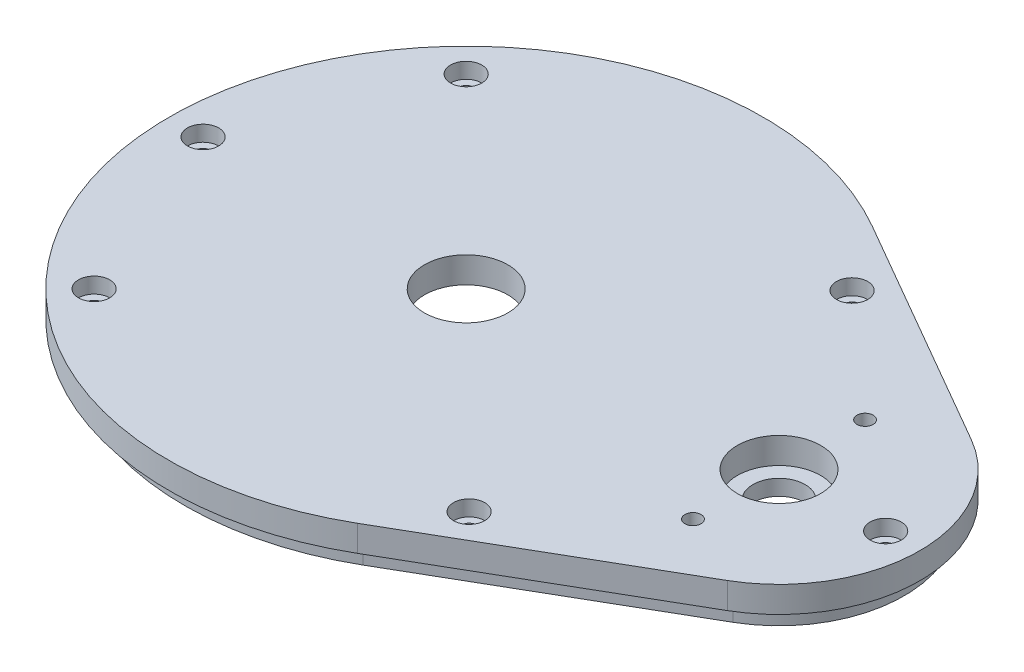
ISO-10303-21;
HEADER;
FILE_DESCRIPTION(('STEP AP214'),'2;1');
FILE_NAME('part.step','',(''),(''),'','','');
FILE_SCHEMA(('AUTOMOTIVE_DESIGN { 1 0 10303 214 1 1 1 1 }'));
ENDSEC;
DATA;
#1=APPLICATION_CONTEXT('core data for automotive mechanical design processes');
#2=APPLICATION_PROTOCOL_DEFINITION('international standard','automotive_design',2000,#1);
#3=PRODUCT_CONTEXT('',#1,'mechanical');
#4=PRODUCT('Part','Part','',(#3));
#5=PRODUCT_RELATED_PRODUCT_CATEGORY('part','',(#4));
#6=PRODUCT_DEFINITION_FORMATION('','',#4);
#7=PRODUCT_DEFINITION_CONTEXT('part definition',#1,'design');
#8=PRODUCT_DEFINITION('design','',#6,#7);
#9=PRODUCT_DEFINITION_SHAPE('','',#8);
#10=(LENGTH_UNIT() NAMED_UNIT(*) SI_UNIT(.MILLI.,.METRE.));
#11=(NAMED_UNIT(*) PLANE_ANGLE_UNIT() SI_UNIT($,.RADIAN.));
#12=(NAMED_UNIT(*) SI_UNIT($,.STERADIAN.) SOLID_ANGLE_UNIT());
#13=UNCERTAINTY_MEASURE_WITH_UNIT(LENGTH_MEASURE(1.E-05),#10,'distance_accuracy_value','');
#14=(GEOMETRIC_REPRESENTATION_CONTEXT(3) GLOBAL_UNCERTAINTY_ASSIGNED_CONTEXT((#13)) GLOBAL_UNIT_ASSIGNED_CONTEXT((#10,
#11,#12)) REPRESENTATION_CONTEXT('',''));
#15=CARTESIAN_POINT('',(0.,0.,0.));
#16=DIRECTION('',(0.,0.,1.));
#17=DIRECTION('',(1.,0.,0.));
#18=AXIS2_PLACEMENT_3D('',#15,#16,#17);
#19=CARTESIAN_POINT('',(22.2847401814526,0.,-36.7283111091591));
#20=DIRECTION('',(0.,1.,0.));
#21=DIRECTION('',(0.,0.,1.));
#22=AXIS2_PLACEMENT_3D('',#19,#20,#21);
#23=CYLINDRICAL_SURFACE('',#22,1.55);
#24=CARTESIAN_POINT('',(22.2847401814526,0.,-36.7283111091591));
#25=DIRECTION('',(0.,-1.,0.));
#26=DIRECTION('',(0.495533960302299,0.,-0.868588564388871));
#27=AXIS2_PLACEMENT_3D('',#24,#25,#26);
#28=CIRCLE('',#27,1.55);
#29=CARTESIAN_POINT('',(23.0528178199212,0.,-38.0746233839619));
#30=VERTEX_POINT('',#29);
#31=CARTESIAN_POINT('',(23.0666419936243,0.,-38.0666419935531));
#32=VERTEX_POINT('',#31);
#33=EDGE_CURVE('E144',#30,#32,#28,.T.);
#34=ORIENTED_EDGE('',*,*,#33,.T.);
#35=CARTESIAN_POINT('',(22.2847401814526,0.,-36.7283111091591));
#36=DIRECTION('',(0.,1.,0.));
#37=DIRECTION('',(0.,0.,1.));
#38=AXIS2_PLACEMENT_3D('',#35,#36,#37);
#39=CIRCLE('',#38,1.55);
#40=EDGE_CURVE('E148',#30,#32,#39,.T.);
#41=ORIENTED_EDGE('',*,*,#40,.F.);
#42=EDGE_LOOP('',(#34,#41));
#43=FACE_BOUND('',#42,.T.);
#44=CARTESIAN_POINT('',(22.2847401814526,2.,-36.7283111091591));
#45=DIRECTION('',(0.,1.,0.));
#46=DIRECTION('',(0.,0.,1.));
#47=AXIS2_PLACEMENT_3D('',#44,#45,#46);
#48=CIRCLE('',#47,1.55);
#49=CARTESIAN_POINT('',(22.2847401814526,2.,-35.1783111091592));
#50=VERTEX_POINT('',#49);
#51=EDGE_CURVE('E39',#50,#50,#48,.F.);
#52=ORIENTED_EDGE('',*,*,#51,.F.);
#53=EDGE_LOOP('',(#52));
#54=FACE_BOUND('',#53,.T.);
#55=ADVANCED_FACE('F35',(#43,#54),#23,.F.);
#56=CARTESIAN_POINT('',(65.4499999999833,0.,0.));
#57=DIRECTION('',(0.,1.,0.));
#58=DIRECTION('',(0.,0.,1.));
#59=AXIS2_PLACEMENT_3D('',#56,#57,#58);
#60=CYLINDRICAL_SURFACE('',#59,1.54999999999999);
#61=CARTESIAN_POINT('',(65.4499999999833,0.,0.));
#62=DIRECTION('',(0.,1.,0.));
#63=DIRECTION('',(0.,0.,1.));
#64=AXIS2_PLACEMENT_3D('',#61,#62,#63);
#65=CIRCLE('',#64,1.54999999999999);
#66=CARTESIAN_POINT('',(66.9999999999833,0.,-6.12423756142233E-13));
#67=VERTEX_POINT('',#66);
#68=EDGE_CURVE('E431',#67,#67,#65,.T.);
#69=ORIENTED_EDGE('',*,*,#68,.F.);
#70=EDGE_LOOP('',(#69));
#71=FACE_BOUND('',#70,.T.);
#72=CARTESIAN_POINT('',(65.4499999999833,2.,0.));
#73=DIRECTION('',(0.,1.,0.));
#74=DIRECTION('',(0.,0.,1.));
#75=AXIS2_PLACEMENT_3D('',#72,#73,#74);
#76=CIRCLE('',#75,1.54999999999999);
#77=CARTESIAN_POINT('',(65.4499999999833,2.,1.54999999999999));
#78=VERTEX_POINT('',#77);
#79=EDGE_CURVE('E445',#78,#78,#76,.F.);
#80=ORIENTED_EDGE('',*,*,#79,.F.);
#81=EDGE_LOOP('',(#80));
#82=FACE_BOUND('',#81,.T.);
#83=ADVANCED_FACE('F390',(#71,#82),#60,.F.);
#84=CARTESIAN_POINT('',(-50.6735371108547,0.,35.6735371108691));
#85=DIRECTION('',(0.,1.,0.));
#86=DIRECTION('',(0.,0.,1.));
#87=AXIS2_PLACEMENT_3D('',#84,#85,#86);
#88=CYLINDRICAL_SURFACE('',#87,1.55);
#89=CARTESIAN_POINT('',(-50.6735371108547,0.,35.6735371108691));
#90=DIRECTION('',(0.,1.,0.));
#91=DIRECTION('',(0.,0.,1.));
#92=AXIS2_PLACEMENT_3D('',#89,#90,#91);
#93=CIRCLE('',#92,1.55);
#94=CARTESIAN_POINT('',(-51.7695526216938,0.,36.7695526217082));
#95=VERTEX_POINT('',#94);
#96=EDGE_CURVE('E164',#95,#95,#93,.T.);
#97=ORIENTED_EDGE('',*,*,#96,.F.);
#98=EDGE_LOOP('',(#97));
#99=FACE_BOUND('',#98,.T.);
#100=CARTESIAN_POINT('',(-50.6735371108547,2.,35.6735371108691));
#101=DIRECTION('',(0.,1.,0.));
#102=DIRECTION('',(0.,0.,1.));
#103=AXIS2_PLACEMENT_3D('',#100,#101,#102);
#104=CIRCLE('',#103,1.55);
#105=CARTESIAN_POINT('',(-50.6735371108547,2.,37.2235371108691));
#106=VERTEX_POINT('',#105);
#107=EDGE_CURVE('E449',#106,#106,#104,.F.);
#108=ORIENTED_EDGE('',*,*,#107,.F.);
#109=EDGE_LOOP('',(#108));
#110=FACE_BOUND('',#109,.T.);
#111=ADVANCED_FACE('F395',(#99,#110),#88,.F.);
#112=CARTESIAN_POINT('',(-50.6735371108711,0.,-35.6735371108371));
#113=DIRECTION('',(0.,1.,0.));
#114=DIRECTION('',(0.,0.,1.));
#115=AXIS2_PLACEMENT_3D('',#112,#113,#114);
#116=CYLINDRICAL_SURFACE('',#115,1.55);
#117=CARTESIAN_POINT('',(-50.6735371108711,0.,-35.6735371108371));
#118=DIRECTION('',(0.,1.,0.));
#119=DIRECTION('',(0.,0.,1.));
#120=AXIS2_PLACEMENT_3D('',#117,#118,#119);
#121=CIRCLE('',#120,1.55);
#122=CARTESIAN_POINT('',(-51.7695526217108,0.,-36.7695526216758));
#123=VERTEX_POINT('',#122);
#124=EDGE_CURVE('E50',#123,#123,#121,.T.);
#125=ORIENTED_EDGE('',*,*,#124,.F.);
#126=EDGE_LOOP('',(#125));
#127=FACE_BOUND('',#126,.T.);
#128=CARTESIAN_POINT('',(-50.6735371108711,2.,-35.6735371108371));
#129=DIRECTION('',(0.,1.,0.));
#130=DIRECTION('',(0.,0.,1.));
#131=AXIS2_PLACEMENT_3D('',#128,#129,#130);
#132=CIRCLE('',#131,1.55);
#133=CARTESIAN_POINT('',(-50.6735371108711,2.,-34.1235371108371));
#134=VERTEX_POINT('',#133);
#135=EDGE_CURVE('E453',#134,#134,#132,.F.);
#136=ORIENTED_EDGE('',*,*,#135,.F.);
#137=EDGE_LOOP('',(#136));
#138=FACE_BOUND('',#137,.T.);
#139=ADVANCED_FACE('F401',(#127,#138),#116,.F.);
#140=CARTESIAN_POINT('',(22.2916419935675,0.,36.7243026177355));
#141=DIRECTION('',(0.,1.,0.));
#142=DIRECTION('',(0.,0.,1.));
#143=AXIS2_PLACEMENT_3D('',#140,#141,#142);
#144=CYLINDRICAL_SURFACE('',#143,1.55);
#145=CARTESIAN_POINT('',(22.2916419935675,0.,36.7243026177355));
#146=DIRECTION('',(0.,1.,0.));
#147=DIRECTION('',(0.,0.,1.));
#148=AXIS2_PLACEMENT_3D('',#145,#146,#147);
#149=CIRCLE('',#148,1.55);
#150=CARTESIAN_POINT('',(23.0666419935675,0.,38.0666419936016));
#151=VERTEX_POINT('',#150);
#152=EDGE_CURVE('E437',#151,#151,#149,.T.);
#153=ORIENTED_EDGE('',*,*,#152,.F.);
#154=EDGE_LOOP('',(#153));
#155=FACE_BOUND('',#154,.T.);
#156=CARTESIAN_POINT('',(22.2916419935675,2.,36.7243026177355));
#157=DIRECTION('',(0.,1.,0.));
#158=DIRECTION('',(0.,0.,1.));
#159=AXIS2_PLACEMENT_3D('',#156,#157,#158);
#160=CIRCLE('',#159,1.55);
#161=CARTESIAN_POINT('',(22.2916419935675,2.,38.2743026177355));
#162=VERTEX_POINT('',#161);
#163=EDGE_CURVE('E457',#162,#162,#160,.F.);
#164=ORIENTED_EDGE('',*,*,#163,.F.);
#165=EDGE_LOOP('',(#164));
#166=FACE_BOUND('',#165,.T.);
#167=ADVANCED_FACE('F554',(#155,#166),#144,.F.);
#168=CARTESIAN_POINT('',(-65.4499999999934,0.,0.));
#169=DIRECTION('',(0.,1.,0.));
#170=DIRECTION('',(0.,0.,1.));
#171=AXIS2_PLACEMENT_3D('',#168,#169,#170);
#172=CYLINDRICAL_SURFACE('',#171,1.54999999999999);
#173=CARTESIAN_POINT('',(-65.4499999999934,0.,0.));
#174=DIRECTION('',(0.,1.,0.));
#175=DIRECTION('',(0.,0.,1.));
#176=AXIS2_PLACEMENT_3D('',#173,#174,#175);
#177=CIRCLE('',#176,1.54999999999999);
#178=CARTESIAN_POINT('',(-66.9999999999934,0.,-2.38500803895854E-13));
#179=VERTEX_POINT('',#178);
#180=EDGE_CURVE('E55',#179,#179,#177,.T.);
#181=ORIENTED_EDGE('',*,*,#180,.F.);
#182=EDGE_LOOP('',(#181));
#183=FACE_BOUND('',#182,.T.);
#184=CARTESIAN_POINT('',(-65.4499999999934,2.,0.));
#185=DIRECTION('',(0.,1.,0.));
#186=DIRECTION('',(0.,0.,1.));
#187=AXIS2_PLACEMENT_3D('',#184,#185,#186);
#188=CIRCLE('',#187,1.54999999999999);
#189=CARTESIAN_POINT('',(-65.4499999999934,2.,1.54999999999999));
#190=VERTEX_POINT('',#189);
#191=EDGE_CURVE('E179',#190,#190,#188,.F.);
#192=ORIENTED_EDGE('',*,*,#191,.F.);
#193=EDGE_LOOP('',(#192));
#194=FACE_BOUND('',#193,.T.);
#195=ADVANCED_FACE('F543',(#183,#194),#172,.F.);
#196=CARTESIAN_POINT('',(-14.9999999999933,0.,7.76281648809408E-12));
#197=DIRECTION('',(0.,1.,0.));
#198=DIRECTION('',(0.,0.,1.));
#199=AXIS2_PLACEMENT_3D('',#196,#197,#198);
#200=PLANE('',#199);
#201=CARTESIAN_POINT('',(-14.9999999999933,0.,7.76281648809408E-12));
#202=DIRECTION('',(0.,1.,0.));
#203=DIRECTION('',(0.,0.,1.));
#204=AXIS2_PLACEMENT_3D('',#201,#202,#203);
#205=CIRCLE('',#204,56.9999999999984);
#206=CARTESIAN_POINT('',(13.5000000000058,0.,-49.3634480157038));
#207=VERTEX_POINT('',#206);
#208=CARTESIAN_POINT('',(13.5000000000069,0.,49.3634480157188));
#209=VERTEX_POINT('',#208);
#210=EDGE_CURVE('E268',#207,#209,#205,.T.);
#211=ORIENTED_EDGE('',*,*,#210,.F.);
#212=DIRECTION('',(-0.866025403784433,0.,-0.500000000000009));
#213=VECTOR('',#212,1.);
#214=CARTESIAN_POINT('',(13.5000000000058,0.,-49.3634480157038));
#215=LINE('',#214,#213);
#216=CARTESIAN_POINT('',(58.4999999999703,0.,-23.3826859021905));
#217=VERTEX_POINT('',#216);
#218=EDGE_CURVE('E275',#217,#207,#215,.T.);
#219=ORIENTED_EDGE('',*,*,#218,.F.);
#220=CARTESIAN_POINT('',(44.9999999999594,0.,8.08273668303762E-12));
#221=DIRECTION('',(0.,1.,0.));
#222=DIRECTION('',(0.,0.,-1.));
#223=AXIS2_PLACEMENT_3D('',#220,#221,#222);
#224=CIRCLE('',#223,27.0000000000217);
#225=CARTESIAN_POINT('',(58.4999999999703,0.,23.3826859022067));
#226=VERTEX_POINT('',#225);
#227=EDGE_CURVE('E286',#226,#217,#224,.T.);
#228=ORIENTED_EDGE('',*,*,#227,.F.);
#229=DIRECTION('',(0.866025403784439,0.,-0.5));
#230=VECTOR('',#229,1.);
#231=CARTESIAN_POINT('',(13.5000000000069,0.,49.3634480157188));
#232=LINE('',#231,#230);
#233=EDGE_CURVE('E284',#209,#226,#232,.T.);
#234=ORIENTED_EDGE('',*,*,#233,.F.);
#235=EDGE_LOOP('',(#211,#219,#228,#234));
#236=FACE_BOUND('',#235,.T.);
#237=CARTESIAN_POINT('',(-14.9999999999933,0.,7.76281648809408E-12));
#238=DIRECTION('',(0.,-1.,0.));
#239=DIRECTION('',(0.,0.,-1.));
#240=AXIS2_PLACEMENT_3D('',#237,#238,#239);
#241=CIRCLE('',#240,54.);
#242=CARTESIAN_POINT('',(12.0000000000062,0.,46.7653718043677));
#243=VERTEX_POINT('',#242);
#244=CARTESIAN_POINT('',(12.0000000000067,0.,-46.7653718043519));
#245=VERTEX_POINT('',#244);
#246=EDGE_CURVE('E204',#243,#245,#241,.T.);
#247=ORIENTED_EDGE('',*,*,#246,.F.);
#248=DIRECTION('',(-0.866025403784444,0.,0.499999999999991));
#249=VECTOR('',#248,1.);
#250=CARTESIAN_POINT('',(12.0000000000062,0.,46.7653718043677));
#251=LINE('',#250,#249);
#252=CARTESIAN_POINT('',(56.9999999999711,0.,20.7846096908554));
#253=VERTEX_POINT('',#252);
#254=EDGE_CURVE('E209',#253,#243,#251,.T.);
#255=ORIENTED_EDGE('',*,*,#254,.F.);
#256=CARTESIAN_POINT('',(44.9999999999594,0.,8.08273668303762E-12));
#257=DIRECTION('',(0.,-1.,0.));
#258=DIRECTION('',(0.,0.,1.));
#259=AXIS2_PLACEMENT_3D('',#256,#257,#258);
#260=CIRCLE('',#259,24.0000000000239);
#261=CARTESIAN_POINT('',(56.9999999999714,0.,-20.7846096908391));
#262=VERTEX_POINT('',#261);
#263=EDGE_CURVE('E221',#262,#253,#260,.T.);
#264=ORIENTED_EDGE('',*,*,#263,.F.);
#265=DIRECTION('',(0.866025403784438,0.,0.5));
#266=VECTOR('',#265,1.);
#267=CARTESIAN_POINT('',(12.0000000000067,0.,-46.7653718043519));
#268=LINE('',#267,#266);
#269=EDGE_CURVE('E218',#245,#262,#268,.T.);
#270=ORIENTED_EDGE('',*,*,#269,.F.);
#271=EDGE_LOOP('',(#247,#255,#264,#270));
#272=FACE_BOUND('',#271,.T.);
#273=ADVANCED_FACE('F372',(#236,#272),#200,.F.);
#274=CARTESIAN_POINT('',(-14.9999999999933,5.,7.76281648809408E-12));
#275=DIRECTION('',(0.,1.,0.));
#276=DIRECTION('',(0.,0.,1.));
#277=AXIS2_PLACEMENT_3D('',#274,#275,#276);
#278=PLANE('',#277);
#279=CARTESIAN_POINT('',(65.4499999999833,5.,0.));
#280=DIRECTION('',(0.,1.,0.));
#281=DIRECTION('',(0.,0.,1.));
#282=AXIS2_PLACEMENT_3D('',#279,#280,#281);
#283=CIRCLE('',#282,3.00000000000001);
#284=CARTESIAN_POINT('',(65.4499999999833,5.,3.00000000000001));
#285=VERTEX_POINT('',#284);
#286=EDGE_CURVE('E474',#285,#285,#283,.T.);
#287=ORIENTED_EDGE('',*,*,#286,.F.);
#288=EDGE_LOOP('',(#287));
#289=FACE_BOUND('',#288,.T.);
#290=CARTESIAN_POINT('',(22.2847401814526,5.,-36.7283111091591));
#291=DIRECTION('',(0.,1.,0.));
#292=DIRECTION('',(0.,0.,1.));
#293=AXIS2_PLACEMENT_3D('',#290,#291,#292);
#294=CIRCLE('',#293,3.);
#295=CARTESIAN_POINT('',(22.2847401814526,5.,-33.7283111091592));
#296=VERTEX_POINT('',#295);
#297=EDGE_CURVE('E480',#296,#296,#294,.T.);
#298=ORIENTED_EDGE('',*,*,#297,.F.);
#299=EDGE_LOOP('',(#298));
#300=FACE_BOUND('',#299,.T.);
#301=CARTESIAN_POINT('',(22.2916419935675,5.,36.7243026177355));
#302=DIRECTION('',(0.,1.,0.));
#303=DIRECTION('',(0.,0.,1.));
#304=AXIS2_PLACEMENT_3D('',#301,#302,#303);
#305=CIRCLE('',#304,3.);
#306=CARTESIAN_POINT('',(22.2916419935675,5.,39.7243026177355));
#307=VERTEX_POINT('',#306);
#308=EDGE_CURVE('E486',#307,#307,#305,.T.);
#309=ORIENTED_EDGE('',*,*,#308,.F.);
#310=EDGE_LOOP('',(#309));
#311=FACE_BOUND('',#310,.T.);
#312=CARTESIAN_POINT('',(-50.6735371108547,5.,35.6735371108691));
#313=DIRECTION('',(0.,1.,0.));
#314=DIRECTION('',(0.,0.,1.));
#315=AXIS2_PLACEMENT_3D('',#312,#313,#314);
#316=CIRCLE('',#315,3.);
#317=CARTESIAN_POINT('',(-50.6735371108547,5.,38.6735371108691));
#318=VERTEX_POINT('',#317);
#319=EDGE_CURVE('E492',#318,#318,#316,.T.);
#320=ORIENTED_EDGE('',*,*,#319,.F.);
#321=EDGE_LOOP('',(#320));
#322=FACE_BOUND('',#321,.T.);
#323=CARTESIAN_POINT('',(-65.4499999999934,5.,0.));
#324=DIRECTION('',(0.,1.,0.));
#325=DIRECTION('',(0.,0.,1.));
#326=AXIS2_PLACEMENT_3D('',#323,#324,#325);
#327=CIRCLE('',#326,3.00000000000001);
#328=CARTESIAN_POINT('',(-65.4499999999934,5.,3.00000000000001));
#329=VERTEX_POINT('',#328);
#330=EDGE_CURVE('E498',#329,#329,#327,.T.);
#331=ORIENTED_EDGE('',*,*,#330,.F.);
#332=EDGE_LOOP('',(#331));
#333=FACE_BOUND('',#332,.T.);
#334=CARTESIAN_POINT('',(-50.6735371108711,5.,-35.6735371108371));
#335=DIRECTION('',(0.,1.,0.));
#336=DIRECTION('',(0.,0.,1.));
#337=AXIS2_PLACEMENT_3D('',#334,#335,#336);
#338=CIRCLE('',#337,3.);
#339=CARTESIAN_POINT('',(-50.6735371108711,5.,-32.6735371108371));
#340=VERTEX_POINT('',#339);
#341=EDGE_CURVE('E466',#340,#340,#338,.T.);
#342=ORIENTED_EDGE('',*,*,#341,.F.);
#343=EDGE_LOOP('',(#342));
#344=FACE_BOUND('',#343,.T.);
#345=CARTESIAN_POINT('',(44.9999999999594,5.,-16.4999999999919));
#346=DIRECTION('',(0.,1.,0.));
#347=DIRECTION('',(0.,0.,1.));
#348=AXIS2_PLACEMENT_3D('',#345,#346,#347);
#349=CIRCLE('',#348,1.55000000004117);
#350=CARTESIAN_POINT('',(44.9999999999594,5.,-14.9499999999507));
#351=VERTEX_POINT('',#350);
#352=EDGE_CURVE('E253',#351,#351,#349,.T.);
#353=ORIENTED_EDGE('',*,*,#352,.F.);
#354=EDGE_LOOP('',(#353));
#355=FACE_BOUND('',#354,.T.);
#356=CARTESIAN_POINT('',(-14.9999999999933,5.,7.76281648809408E-12));
#357=DIRECTION('',(0.,1.,0.));
#358=DIRECTION('',(0.,0.,1.));
#359=AXIS2_PLACEMENT_3D('',#356,#357,#358);
#360=CIRCLE('',#359,7.99999999999596);
#361=CARTESIAN_POINT('',(-14.9999999999933,5.,8.00000000000373));
#362=VERTEX_POINT('',#361);
#363=EDGE_CURVE('E265',#362,#362,#360,.T.);
#364=ORIENTED_EDGE('',*,*,#363,.F.);
#365=EDGE_LOOP('',(#364));
#366=FACE_BOUND('',#365,.T.);
#367=CARTESIAN_POINT('',(-14.9999999999933,5.,7.76281648809408E-12));
#368=DIRECTION('',(0.,1.,0.));
#369=DIRECTION('',(0.,0.,1.));
#370=AXIS2_PLACEMENT_3D('',#367,#368,#369);
#371=CIRCLE('',#370,56.9999999999984);
#372=CARTESIAN_POINT('',(13.5000000000058,5.,-49.3634480157038));
#373=VERTEX_POINT('',#372);
#374=CARTESIAN_POINT('',(13.5000000000069,5.,49.3634480157188));
#375=VERTEX_POINT('',#374);
#376=EDGE_CURVE('E271',#373,#375,#371,.T.);
#377=ORIENTED_EDGE('',*,*,#376,.T.);
#378=DIRECTION('',(0.866025403784439,0.,-0.5));
#379=VECTOR('',#378,1.);
#380=CARTESIAN_POINT('',(13.5000000000069,5.,49.3634480157188));
#381=LINE('',#380,#379);
#382=CARTESIAN_POINT('',(58.4999999999703,5.,23.3826859022067));
#383=VERTEX_POINT('',#382);
#384=EDGE_CURVE('E274',#375,#383,#381,.T.);
#385=ORIENTED_EDGE('',*,*,#384,.T.);
#386=CARTESIAN_POINT('',(44.9999999999594,5.,8.08273668303762E-12));
#387=DIRECTION('',(0.,1.,0.));
#388=DIRECTION('',(0.,0.,-1.));
#389=AXIS2_PLACEMENT_3D('',#386,#387,#388);
#390=CIRCLE('',#389,27.0000000000217);
#391=CARTESIAN_POINT('',(58.4999999999703,5.,-23.3826859021905));
#392=VERTEX_POINT('',#391);
#393=EDGE_CURVE('E277',#383,#392,#390,.T.);
#394=ORIENTED_EDGE('',*,*,#393,.T.);
#395=DIRECTION('',(-0.866025403784433,0.,-0.500000000000009));
#396=VECTOR('',#395,1.);
#397=CARTESIAN_POINT('',(13.5000000000058,5.,-49.3634480157038));
#398=LINE('',#397,#396);
#399=EDGE_CURVE('E279',#392,#373,#398,.T.);
#400=ORIENTED_EDGE('',*,*,#399,.T.);
#401=EDGE_LOOP('',(#377,#385,#394,#400));
#402=FACE_BOUND('',#401,.T.);
#403=CARTESIAN_POINT('',(44.9999999999594,5.,8.08273668303762E-12));
#404=DIRECTION('',(0.,1.,0.));
#405=DIRECTION('',(0.,0.,1.));
#406=AXIS2_PLACEMENT_3D('',#403,#404,#405);
#407=CIRCLE('',#406,8.00000000004117);
#408=CARTESIAN_POINT('',(44.9999999999594,5.,8.00000000004925));
#409=VERTEX_POINT('',#408);
#410=EDGE_CURVE('E259',#409,#409,#407,.T.);
#411=ORIENTED_EDGE('',*,*,#410,.F.);
#412=EDGE_LOOP('',(#411));
#413=FACE_BOUND('',#412,.T.);
#414=CARTESIAN_POINT('',(44.9999999999594,5.,16.5000000000081));
#415=DIRECTION('',(0.,1.,0.));
#416=DIRECTION('',(0.,0.,1.));
#417=AXIS2_PLACEMENT_3D('',#414,#415,#416);
#418=CIRCLE('',#417,1.55000000004118);
#419=CARTESIAN_POINT('',(44.9999999999594,5.,18.0500000000493));
#420=VERTEX_POINT('',#419);
#421=EDGE_CURVE('E247',#420,#420,#418,.T.);
#422=ORIENTED_EDGE('',*,*,#421,.F.);
#423=EDGE_LOOP('',(#422));
#424=FACE_BOUND('',#423,.T.);
#425=ADVANCED_FACE('F369',(#289,#300,#311,#322,#333,#344,#355,#366,#402,#413,#424),#278,.T.);
#426=CARTESIAN_POINT('',(-14.9999999999933,0.,7.76281648809408E-12));
#427=DIRECTION('',(0.,-1.,0.));
#428=DIRECTION('',(0.,0.,1.));
#429=AXIS2_PLACEMENT_3D('',#426,#427,#428);
#430=CIRCLE('',#429,52.);
#431=EDGE_CURVE('E172',#95,#179,#430,.T.);
#432=ORIENTED_EDGE('',*,*,#431,.T.);
#433=ORIENTED_EDGE('',*,*,#180,.T.);
#434=EDGE_CURVE('E856',#179,#123,#430,.T.);
#435=ORIENTED_EDGE('',*,*,#434,.T.);
#436=ORIENTED_EDGE('',*,*,#124,.T.);
#437=CARTESIAN_POINT('',(11.0000000000067,0.,-45.0333209967831));
#438=VERTEX_POINT('',#437);
#439=EDGE_CURVE('E174',#123,#438,#430,.T.);
#440=ORIENTED_EDGE('',*,*,#439,.T.);
#441=DIRECTION('',(0.866025403784439,0.,0.5));
#442=VECTOR('',#441,1.);
#443=CARTESIAN_POINT('',(11.0000000000067,0.,-45.0333209967831));
#444=LINE('',#443,#442);
#445=EDGE_CURVE('E154',#438,#30,#444,.T.);
#446=ORIENTED_EDGE('',*,*,#445,.T.);
#447=ORIENTED_EDGE('',*,*,#40,.T.);
#448=CARTESIAN_POINT('',(55.9999999999714,0.,-19.0525588832703));
#449=VERTEX_POINT('',#448);
#450=EDGE_CURVE('E155',#32,#449,#444,.T.);
#451=ORIENTED_EDGE('',*,*,#450,.T.);
#452=CARTESIAN_POINT('',(44.9999999999594,0.,8.08273668303762E-12));
#453=DIRECTION('',(0.,-1.,0.));
#454=DIRECTION('',(0.,0.,-1.));
#455=AXIS2_PLACEMENT_3D('',#452,#453,#454);
#456=CIRCLE('',#455,22.0000000000239);
#457=EDGE_CURVE('E184',#449,#67,#456,.T.);
#458=ORIENTED_EDGE('',*,*,#457,.T.);
#459=ORIENTED_EDGE('',*,*,#68,.T.);
#460=CARTESIAN_POINT('',(55.9999999999712,0.,19.0525588832866));
#461=VERTEX_POINT('',#460);
#462=EDGE_CURVE('E188',#67,#461,#456,.T.);
#463=ORIENTED_EDGE('',*,*,#462,.T.);
#464=DIRECTION('',(-0.866025403784444,0.,0.499999999999991));
#465=VECTOR('',#464,1.);
#466=CARTESIAN_POINT('',(11.0000000000062,0.,45.0333209967989));
#467=LINE('',#466,#465);
#468=EDGE_CURVE('E189',#461,#151,#467,.T.);
#469=ORIENTED_EDGE('',*,*,#468,.T.);
#470=ORIENTED_EDGE('',*,*,#152,.T.);
#471=CARTESIAN_POINT('',(11.0000000000062,0.,45.0333209967989));
#472=VERTEX_POINT('',#471);
#473=EDGE_CURVE('E187',#151,#472,#467,.T.);
#474=ORIENTED_EDGE('',*,*,#473,.T.);
#475=EDGE_CURVE('E169',#472,#95,#430,.T.);
#476=ORIENTED_EDGE('',*,*,#475,.T.);
#477=ORIENTED_EDGE('',*,*,#96,.T.);
#478=EDGE_LOOP('',(#432,#433,#435,#436,#440,#446,#447,#451,#458,#459,#463,#469,#470,#474,#476,#477));
#479=FACE_BOUND('',#478,.T.);
#480=CARTESIAN_POINT('',(44.9999999999594,0.,8.08273668303762E-12));
#481=DIRECTION('',(0.,1.,0.));
#482=DIRECTION('',(0.,0.,1.));
#483=AXIS2_PLACEMENT_3D('',#480,#481,#482);
#484=CIRCLE('',#483,12.0000000000364);
#485=CARTESIAN_POINT('',(44.9999999999594,0.,12.0000000000445));
#486=VERTEX_POINT('',#485);
#487=EDGE_CURVE('E11',#486,#486,#484,.F.);
#488=ORIENTED_EDGE('',*,*,#487,.F.);
#489=EDGE_LOOP('',(#488));
#490=FACE_BOUND('',#489,.T.);
#491=CARTESIAN_POINT('',(-14.9999999999933,0.,7.76281648809408E-12));
#492=DIRECTION('',(0.,1.,0.));
#493=DIRECTION('',(0.,0.,1.));
#494=AXIS2_PLACEMENT_3D('',#491,#492,#493);
#495=CIRCLE('',#494,7.99999999999596);
#496=CARTESIAN_POINT('',(-14.9999999999933,0.,8.00000000000373));
#497=VERTEX_POINT('',#496);
#498=EDGE_CURVE('E262',#497,#497,#495,.T.);
#499=ORIENTED_EDGE('',*,*,#498,.T.);
#500=EDGE_LOOP('',(#499));
#501=FACE_BOUND('',#500,.T.);
#502=CARTESIAN_POINT('',(44.9999999999594,0.,-16.4999999999919));
#503=DIRECTION('',(0.,1.,0.));
#504=DIRECTION('',(0.,0.,1.));
#505=AXIS2_PLACEMENT_3D('',#502,#503,#504);
#506=CIRCLE('',#505,1.55000000004117);
#507=CARTESIAN_POINT('',(44.9999999999594,0.,-14.9499999999507));
#508=VERTEX_POINT('',#507);
#509=EDGE_CURVE('E250',#508,#508,#506,.T.);
#510=ORIENTED_EDGE('',*,*,#509,.T.);
#511=EDGE_LOOP('',(#510));
#512=FACE_BOUND('',#511,.T.);
#513=CARTESIAN_POINT('',(44.9999999999594,0.,16.5000000000081));
#514=DIRECTION('',(0.,1.,0.));
#515=DIRECTION('',(0.,0.,1.));
#516=AXIS2_PLACEMENT_3D('',#513,#514,#515);
#517=CIRCLE('',#516,1.55000000004118);
#518=CARTESIAN_POINT('',(44.9999999999594,0.,18.0500000000493));
#519=VERTEX_POINT('',#518);
#520=EDGE_CURVE('E246',#519,#519,#517,.T.);
#521=ORIENTED_EDGE('',*,*,#520,.T.);
#522=EDGE_LOOP('',(#521));
#523=FACE_BOUND('',#522,.T.);
#524=ADVANCED_FACE('F160',(#479,#490,#501,#512,#523),#200,.F.);
#525=CARTESIAN_POINT('',(-14.9999999999933,5.,7.76281648809408E-12));
#526=DIRECTION('',(0.,-1.,0.));
#527=DIRECTION('',(0.,0.,-1.));
#528=AXIS2_PLACEMENT_3D('',#525,#526,#527);
#529=CYLINDRICAL_SURFACE('',#528,56.9999999999984);
#530=ORIENTED_EDGE('',*,*,#210,.T.);
#531=DIRECTION('',(0.,-1.,0.));
#532=VECTOR('',#531,1.);
#533=CARTESIAN_POINT('',(13.5000000000069,5.,49.3634480157188));
#534=LINE('',#533,#532);
#535=EDGE_CURVE('E44',#375,#209,#534,.T.);
#536=ORIENTED_EDGE('',*,*,#535,.F.);
#537=ORIENTED_EDGE('',*,*,#376,.F.);
#538=DIRECTION('',(0.,-1.,0.));
#539=VECTOR('',#538,1.);
#540=CARTESIAN_POINT('',(13.5000000000058,5.,-49.3634480157038));
#541=LINE('',#540,#539);
#542=EDGE_CURVE('E281',#373,#207,#541,.T.);
#543=ORIENTED_EDGE('',*,*,#542,.T.);
#544=EDGE_LOOP('',(#530,#536,#537,#543));
#545=FACE_BOUND('',#544,.T.);
#546=ADVANCED_FACE('F37',(#545),#529,.T.);
#547=CARTESIAN_POINT('',(13.5000000000069,5.,49.3634480157188));
#548=DIRECTION('',(-0.5,0.,-0.866025403784439));
#549=DIRECTION('',(-0.866025403784439,0.,0.5));
#550=AXIS2_PLACEMENT_3D('',#547,#548,#549);
#551=PLANE('',#550);
#552=ORIENTED_EDGE('',*,*,#233,.T.);
#553=DIRECTION('',(0.,-1.,0.));
#554=VECTOR('',#553,1.);
#555=CARTESIAN_POINT('',(58.4999999999703,5.,23.3826859022067));
#556=LINE('',#555,#554);
#557=EDGE_CURVE('E294',#383,#226,#556,.T.);
#558=ORIENTED_EDGE('',*,*,#557,.F.);
#559=ORIENTED_EDGE('',*,*,#384,.F.);
#560=ORIENTED_EDGE('',*,*,#535,.T.);
#561=EDGE_LOOP('',(#552,#558,#559,#560));
#562=FACE_BOUND('',#561,.T.);
#563=ADVANCED_FACE('F381',(#562),#551,.F.);
#564=CARTESIAN_POINT('',(44.9999999999594,5.,8.08273668303762E-12));
#565=DIRECTION('',(0.,-1.,0.));
#566=DIRECTION('',(0.,0.,-1.));
#567=AXIS2_PLACEMENT_3D('',#564,#565,#566);
#568=CYLINDRICAL_SURFACE('',#567,27.0000000000217);
#569=ORIENTED_EDGE('',*,*,#227,.T.);
#570=DIRECTION('',(0.,-1.,0.));
#571=VECTOR('',#570,1.);
#572=CARTESIAN_POINT('',(58.4999999999703,5.,-23.3826859021905));
#573=LINE('',#572,#571);
#574=EDGE_CURVE('E291',#392,#217,#573,.T.);
#575=ORIENTED_EDGE('',*,*,#574,.F.);
#576=ORIENTED_EDGE('',*,*,#393,.F.);
#577=ORIENTED_EDGE('',*,*,#557,.T.);
#578=EDGE_LOOP('',(#569,#575,#576,#577));
#579=FACE_BOUND('',#578,.T.);
#580=ADVANCED_FACE('F378',(#579),#568,.T.);
#581=CARTESIAN_POINT('',(13.5000000000058,5.,-49.3634480157038));
#582=DIRECTION('',(-0.500000000000009,0.,0.866025403784433));
#583=DIRECTION('',(0.866025403784433,0.,0.500000000000009));
#584=AXIS2_PLACEMENT_3D('',#581,#582,#583);
#585=PLANE('',#584);
#586=ORIENTED_EDGE('',*,*,#218,.T.);
#587=ORIENTED_EDGE('',*,*,#542,.F.);
#588=ORIENTED_EDGE('',*,*,#399,.F.);
#589=ORIENTED_EDGE('',*,*,#574,.T.);
#590=EDGE_LOOP('',(#586,#587,#588,#589));
#591=FACE_BOUND('',#590,.T.);
#592=ADVANCED_FACE('F367',(#591),#585,.F.);
#593=CARTESIAN_POINT('',(-14.9999999999933,5.,7.76281648809408E-12));
#594=DIRECTION('',(0.,-1.,0.));
#595=DIRECTION('',(0.,0.,-1.));
#596=AXIS2_PLACEMENT_3D('',#593,#594,#595);
#597=CYLINDRICAL_SURFACE('',#596,7.99999999999596);
#598=ORIENTED_EDGE('',*,*,#363,.T.);
#599=EDGE_LOOP('',(#598));
#600=FACE_BOUND('',#599,.T.);
#601=ORIENTED_EDGE('',*,*,#498,.F.);
#602=EDGE_LOOP('',(#601));
#603=FACE_BOUND('',#602,.T.);
#604=ADVANCED_FACE('F363',(#600,#603),#597,.F.);
#605=CARTESIAN_POINT('',(44.9999999999594,5.,8.08273668303762E-12));
#606=DIRECTION('',(0.,-1.,0.));
#607=DIRECTION('',(0.,0.,-1.));
#608=AXIS2_PLACEMENT_3D('',#605,#606,#607);
#609=CYLINDRICAL_SURFACE('',#608,8.00000000004117);
#610=ORIENTED_EDGE('',*,*,#410,.T.);
#611=EDGE_LOOP('',(#610));
#612=FACE_BOUND('',#611,.T.);
#613=CARTESIAN_POINT('',(44.9999999999594,0.,8.08273668303762E-12));
#614=DIRECTION('',(0.,1.,0.));
#615=DIRECTION('',(0.,0.,1.));
#616=AXIS2_PLACEMENT_3D('',#613,#614,#615);
#617=CIRCLE('',#616,8.00000000004117);
#618=CARTESIAN_POINT('',(44.9999999999594,0.,8.00000000004925));
#619=VERTEX_POINT('',#618);
#620=EDGE_CURVE('E256',#619,#619,#617,.T.);
#621=ORIENTED_EDGE('',*,*,#620,.F.);
#622=EDGE_LOOP('',(#621));
#623=FACE_BOUND('',#622,.T.);
#624=ADVANCED_FACE('F359',(#612,#623),#609,.F.);
#625=CARTESIAN_POINT('',(44.9999999999594,5.,-16.4999999999919));
#626=DIRECTION('',(0.,-1.,0.));
#627=DIRECTION('',(0.,0.,-1.));
#628=AXIS2_PLACEMENT_3D('',#625,#626,#627);
#629=CYLINDRICAL_SURFACE('',#628,1.55000000004117);
#630=ORIENTED_EDGE('',*,*,#352,.T.);
#631=EDGE_LOOP('',(#630));
#632=FACE_BOUND('',#631,.T.);
#633=ORIENTED_EDGE('',*,*,#509,.F.);
#634=EDGE_LOOP('',(#633));
#635=FACE_BOUND('',#634,.T.);
#636=ADVANCED_FACE('F355',(#632,#635),#629,.F.);
#637=CARTESIAN_POINT('',(44.9999999999594,5.,16.5000000000081));
#638=DIRECTION('',(0.,-1.,0.));
#639=DIRECTION('',(0.,0.,-1.));
#640=AXIS2_PLACEMENT_3D('',#637,#638,#639);
#641=CYLINDRICAL_SURFACE('',#640,1.55000000004118);
#642=ORIENTED_EDGE('',*,*,#421,.T.);
#643=EDGE_LOOP('',(#642));
#644=FACE_BOUND('',#643,.T.);
#645=ORIENTED_EDGE('',*,*,#520,.F.);
#646=EDGE_LOOP('',(#645));
#647=FACE_BOUND('',#646,.T.);
#648=ADVANCED_FACE('F348',(#644,#647),#641,.F.);
#649=CARTESIAN_POINT('',(44.9999999999594,0.,8.08273668303762E-12));
#650=DIRECTION('',(0.,-1.,0.));
#651=DIRECTION('',(0.,0.,-1.));
#652=AXIS2_PLACEMENT_3D('',#649,#650,#651);
#653=PLANE('',#652);
#654=CARTESIAN_POINT('',(44.9999999999594,0.,8.08273668303762E-12));
#655=DIRECTION('',(0.,-1.,0.));
#656=DIRECTION('',(0.,0.,-1.));
#657=AXIS2_PLACEMENT_3D('',#654,#655,#656);
#658=CIRCLE('',#657,5.00000000003645);
#659=CARTESIAN_POINT('',(44.9999999999594,0.,-5.00000000002836));
#660=VERTEX_POINT('',#659);
#661=EDGE_CURVE('E237',#660,#660,#658,.T.);
#662=ORIENTED_EDGE('',*,*,#661,.T.);
#663=EDGE_LOOP('',(#662));
#664=FACE_BOUND('',#663,.T.);
#665=ORIENTED_EDGE('',*,*,#620,.T.);
#666=EDGE_LOOP('',(#665));
#667=FACE_BOUND('',#666,.T.);
#668=ADVANCED_FACE('F344',(#664,#667),#653,.F.);
#669=CARTESIAN_POINT('',(44.9999999999594,-3.,8.08273668303762E-12));
#670=DIRECTION('',(0.,-1.,0.));
#671=DIRECTION('',(0.,0.,-1.));
#672=AXIS2_PLACEMENT_3D('',#669,#670,#671);
#673=PLANE('',#672);
#674=CARTESIAN_POINT('',(44.9999999999594,-3.,8.08273668303762E-12));
#675=DIRECTION('',(0.,-1.,0.));
#676=DIRECTION('',(0.,0.,-1.));
#677=AXIS2_PLACEMENT_3D('',#674,#675,#676);
#678=CIRCLE('',#677,12.0000000000364);
#679=CARTESIAN_POINT('',(44.9999999999594,-3.,-12.0000000000284));
#680=VERTEX_POINT('',#679);
#681=EDGE_CURVE('E241',#680,#680,#678,.T.);
#682=ORIENTED_EDGE('',*,*,#681,.T.);
#683=EDGE_LOOP('',(#682));
#684=FACE_BOUND('',#683,.T.);
#685=CARTESIAN_POINT('',(44.9999999999594,-3.,8.08273668303762E-12));
#686=DIRECTION('',(0.,-1.,0.));
#687=DIRECTION('',(0.,0.,-1.));
#688=AXIS2_PLACEMENT_3D('',#685,#686,#687);
#689=CIRCLE('',#688,5.00000000003645);
#690=CARTESIAN_POINT('',(44.9999999999594,-3.,-5.00000000002836));
#691=VERTEX_POINT('',#690);
#692=EDGE_CURVE('E238',#691,#691,#689,.T.);
#693=ORIENTED_EDGE('',*,*,#692,.F.);
#694=EDGE_LOOP('',(#693));
#695=FACE_BOUND('',#694,.T.);
#696=ADVANCED_FACE('F341',(#684,#695),#673,.T.);
#697=CARTESIAN_POINT('',(44.9999999999594,-3.,8.08273668303762E-12));
#698=DIRECTION('',(0.,1.,0.));
#699=DIRECTION('',(0.,0.,1.));
#700=AXIS2_PLACEMENT_3D('',#697,#698,#699);
#701=CYLINDRICAL_SURFACE('',#700,12.0000000000364);
#702=ORIENTED_EDGE('',*,*,#681,.F.);
#703=EDGE_LOOP('',(#702));
#704=FACE_BOUND('',#703,.T.);
#705=ORIENTED_EDGE('',*,*,#487,.T.);
#706=EDGE_LOOP('',(#705));
#707=FACE_BOUND('',#706,.T.);
#708=ADVANCED_FACE('F339',(#704,#707),#701,.T.);
#709=CARTESIAN_POINT('',(44.9999999999594,-3.,8.08273668303762E-12));
#710=DIRECTION('',(0.,1.,0.));
#711=DIRECTION('',(0.,0.,1.));
#712=AXIS2_PLACEMENT_3D('',#709,#710,#711);
#713=CYLINDRICAL_SURFACE('',#712,5.00000000003645);
#714=ORIENTED_EDGE('',*,*,#692,.T.);
#715=EDGE_LOOP('',(#714));
#716=FACE_BOUND('',#715,.T.);
#717=ORIENTED_EDGE('',*,*,#661,.F.);
#718=EDGE_LOOP('',(#717));
#719=FACE_BOUND('',#718,.T.);
#720=ADVANCED_FACE('F321',(#716,#719),#713,.F.);
#721=CARTESIAN_POINT('',(-14.9999999999933,-4.,7.76281648809408E-12));
#722=DIRECTION('',(0.,-1.,0.));
#723=DIRECTION('',(0.,0.,-1.));
#724=AXIS2_PLACEMENT_3D('',#721,#722,#723);
#725=PLANE('',#724);
#726=CARTESIAN_POINT('',(-14.9999999999933,-4.,7.76281648809408E-12));
#727=DIRECTION('',(0.,-1.,0.));
#728=DIRECTION('',(0.,0.,-1.));
#729=AXIS2_PLACEMENT_3D('',#726,#727,#728);
#730=CIRCLE('',#729,54.);
#731=CARTESIAN_POINT('',(12.0000000000062,-4.,46.7653718043677));
#732=VERTEX_POINT('',#731);
#733=CARTESIAN_POINT('',(12.0000000000067,-4.,-46.7653718043519));
#734=VERTEX_POINT('',#733);
#735=EDGE_CURVE('E205',#732,#734,#730,.T.);
#736=ORIENTED_EDGE('',*,*,#735,.T.);
#737=DIRECTION('',(0.866025403784438,0.,0.5));
#738=VECTOR('',#737,1.);
#739=CARTESIAN_POINT('',(12.0000000000067,-4.,-46.7653718043519));
#740=LINE('',#739,#738);
#741=CARTESIAN_POINT('',(56.9999999999714,-4.,-20.7846096908391));
#742=VERTEX_POINT('',#741);
#743=EDGE_CURVE('E208',#734,#742,#740,.T.);
#744=ORIENTED_EDGE('',*,*,#743,.T.);
#745=CARTESIAN_POINT('',(44.9999999999594,-4.,8.08273668303762E-12));
#746=DIRECTION('',(0.,-1.,0.));
#747=DIRECTION('',(0.,0.,1.));
#748=AXIS2_PLACEMENT_3D('',#745,#746,#747);
#749=CIRCLE('',#748,24.0000000000239);
#750=CARTESIAN_POINT('',(56.9999999999711,-4.,20.7846096908554));
#751=VERTEX_POINT('',#750);
#752=EDGE_CURVE('E211',#742,#751,#749,.T.);
#753=ORIENTED_EDGE('',*,*,#752,.T.);
#754=DIRECTION('',(-0.866025403784444,0.,0.499999999999991));
#755=VECTOR('',#754,1.);
#756=CARTESIAN_POINT('',(12.0000000000062,-4.,46.7653718043677));
#757=LINE('',#756,#755);
#758=EDGE_CURVE('E213',#751,#732,#757,.T.);
#759=ORIENTED_EDGE('',*,*,#758,.T.);
#760=EDGE_LOOP('',(#736,#744,#753,#759));
#761=FACE_BOUND('',#760,.T.);
#762=DIRECTION('',(0.866025403784439,0.,0.5));
#763=VECTOR('',#762,1.);
#764=CARTESIAN_POINT('',(11.0000000000067,-4.,-45.0333209967831));
#765=LINE('',#764,#763);
#766=CARTESIAN_POINT('',(11.0000000000067,-4.,-45.0333209967831));
#767=VERTEX_POINT('',#766);
#768=CARTESIAN_POINT('',(55.9999999999714,-4.,-19.0525588832703));
#769=VERTEX_POINT('',#768);
#770=EDGE_CURVE('E411',#767,#769,#765,.T.);
#771=ORIENTED_EDGE('',*,*,#770,.F.);
#772=CARTESIAN_POINT('',(-14.9999999999933,-4.,7.76281648809408E-12));
#773=DIRECTION('',(0.,-1.,0.));
#774=DIRECTION('',(0.,0.,1.));
#775=AXIS2_PLACEMENT_3D('',#772,#773,#774);
#776=CIRCLE('',#775,52.);
#777=CARTESIAN_POINT('',(11.0000000000062,-4.,45.0333209967989));
#778=VERTEX_POINT('',#777);
#779=EDGE_CURVE('E192',#778,#767,#776,.T.);
#780=ORIENTED_EDGE('',*,*,#779,.F.);
#781=DIRECTION('',(-0.866025403784444,0.,0.499999999999991));
#782=VECTOR('',#781,1.);
#783=CARTESIAN_POINT('',(11.0000000000062,-4.,45.0333209967989));
#784=LINE('',#783,#782);
#785=CARTESIAN_POINT('',(55.9999999999712,-4.,19.0525588832866));
#786=VERTEX_POINT('',#785);
#787=EDGE_CURVE('E197',#786,#778,#784,.T.);
#788=ORIENTED_EDGE('',*,*,#787,.F.);
#789=CARTESIAN_POINT('',(44.9999999999594,-4.,8.08273668303762E-12));
#790=DIRECTION('',(0.,-1.,0.));
#791=DIRECTION('',(0.,0.,-1.));
#792=AXIS2_PLACEMENT_3D('',#789,#790,#791);
#793=CIRCLE('',#792,22.0000000000239);
#794=EDGE_CURVE('E413',#769,#786,#793,.T.);
#795=ORIENTED_EDGE('',*,*,#794,.F.);
#796=EDGE_LOOP('',(#771,#780,#788,#795));
#797=FACE_BOUND('',#796,.T.);
#798=ADVANCED_FACE('F317',(#761,#797),#725,.T.);
#799=CARTESIAN_POINT('',(-14.9999999999933,-4.,7.76281648809408E-12));
#800=DIRECTION('',(0.,1.,0.));
#801=DIRECTION('',(0.,0.,1.));
#802=AXIS2_PLACEMENT_3D('',#799,#800,#801);
#803=CYLINDRICAL_SURFACE('',#802,54.);
#804=ORIENTED_EDGE('',*,*,#246,.T.);
#805=DIRECTION('',(0.,1.,0.));
#806=VECTOR('',#805,1.);
#807=CARTESIAN_POINT('',(12.0000000000067,-4.,-46.7653718043519));
#808=LINE('',#807,#806);
#809=EDGE_CURVE('E234',#734,#245,#808,.T.);
#810=ORIENTED_EDGE('',*,*,#809,.F.);
#811=ORIENTED_EDGE('',*,*,#735,.F.);
#812=DIRECTION('',(0.,1.,0.));
#813=VECTOR('',#812,1.);
#814=CARTESIAN_POINT('',(12.0000000000062,-4.,46.7653718043677));
#815=LINE('',#814,#813);
#816=EDGE_CURVE('E215',#732,#243,#815,.T.);
#817=ORIENTED_EDGE('',*,*,#816,.T.);
#818=EDGE_LOOP('',(#804,#810,#811,#817));
#819=FACE_BOUND('',#818,.T.);
#820=ADVANCED_FACE('F320',(#819),#803,.T.);
#821=CARTESIAN_POINT('',(12.0000000000067,-4.,-46.7653718043519));
#822=DIRECTION('',(-0.5,0.,0.866025403784438));
#823=DIRECTION('',(0.866025403784439,0.,0.5));
#824=AXIS2_PLACEMENT_3D('',#821,#822,#823);
#825=PLANE('',#824);
#826=ORIENTED_EDGE('',*,*,#269,.T.);
#827=DIRECTION('',(0.,1.,0.));
#828=VECTOR('',#827,1.);
#829=CARTESIAN_POINT('',(56.9999999999714,-4.,-20.7846096908391));
#830=LINE('',#829,#828);
#831=EDGE_CURVE('E231',#742,#262,#830,.T.);
#832=ORIENTED_EDGE('',*,*,#831,.F.);
#833=ORIENTED_EDGE('',*,*,#743,.F.);
#834=ORIENTED_EDGE('',*,*,#809,.T.);
#835=EDGE_LOOP('',(#826,#832,#833,#834));
#836=FACE_BOUND('',#835,.T.);
#837=ADVANCED_FACE('F329',(#836),#825,.F.);
#838=CARTESIAN_POINT('',(44.9999999999594,-4.,8.08273668303762E-12));
#839=DIRECTION('',(0.,1.,0.));
#840=DIRECTION('',(0.,0.,1.));
#841=AXIS2_PLACEMENT_3D('',#838,#839,#840);
#842=CYLINDRICAL_SURFACE('',#841,24.0000000000239);
#843=ORIENTED_EDGE('',*,*,#263,.T.);
#844=DIRECTION('',(0.,1.,0.));
#845=VECTOR('',#844,1.);
#846=CARTESIAN_POINT('',(56.9999999999711,-4.,20.7846096908554));
#847=LINE('',#846,#845);
#848=EDGE_CURVE('E228',#751,#253,#847,.T.);
#849=ORIENTED_EDGE('',*,*,#848,.F.);
#850=ORIENTED_EDGE('',*,*,#752,.F.);
#851=ORIENTED_EDGE('',*,*,#831,.T.);
#852=EDGE_LOOP('',(#843,#849,#850,#851));
#853=FACE_BOUND('',#852,.T.);
#854=ADVANCED_FACE('F325',(#853),#842,.T.);
#855=CARTESIAN_POINT('',(12.0000000000062,-4.,46.7653718043677));
#856=DIRECTION('',(-0.499999999999991,0.,-0.866025403784444));
#857=DIRECTION('',(-0.866025403784444,0.,0.499999999999991));
#858=AXIS2_PLACEMENT_3D('',#855,#856,#857);
#859=PLANE('',#858);
#860=ORIENTED_EDGE('',*,*,#254,.T.);
#861=ORIENTED_EDGE('',*,*,#816,.F.);
#862=ORIENTED_EDGE('',*,*,#758,.F.);
#863=ORIENTED_EDGE('',*,*,#848,.T.);
#864=EDGE_LOOP('',(#860,#861,#862,#863));
#865=FACE_BOUND('',#864,.T.);
#866=ADVANCED_FACE('F315',(#865),#859,.F.);
#867=CARTESIAN_POINT('',(-14.9999999999933,-4.,7.76281648809408E-12));
#868=DIRECTION('',(0.,1.,0.));
#869=DIRECTION('',(0.,0.,1.));
#870=AXIS2_PLACEMENT_3D('',#867,#868,#869);
#871=CYLINDRICAL_SURFACE('',#870,52.);
#872=ORIENTED_EDGE('',*,*,#475,.F.);
#873=DIRECTION('',(0.,1.,0.));
#874=VECTOR('',#873,1.);
#875=CARTESIAN_POINT('',(11.0000000000062,-4.,45.0333209967989));
#876=LINE('',#875,#874);
#877=EDGE_CURVE('E193',#778,#472,#876,.T.);
#878=ORIENTED_EDGE('',*,*,#877,.F.);
#879=ORIENTED_EDGE('',*,*,#779,.T.);
#880=DIRECTION('',(0.,1.,0.));
#881=VECTOR('',#880,1.);
#882=CARTESIAN_POINT('',(11.0000000000067,-4.,-45.0333209967831));
#883=LINE('',#882,#881);
#884=EDGE_CURVE('E201',#767,#438,#883,.T.);
#885=ORIENTED_EDGE('',*,*,#884,.T.);
#886=ORIENTED_EDGE('',*,*,#439,.F.);
#887=ORIENTED_EDGE('',*,*,#434,.F.);
#888=ORIENTED_EDGE('',*,*,#431,.F.);
#889=EDGE_LOOP('',(#872,#878,#879,#885,#886,#887,#888));
#890=FACE_BOUND('',#889,.T.);
#891=ADVANCED_FACE('F311',(#890),#871,.F.);
#892=CARTESIAN_POINT('',(11.0000000000067,-4.,-45.0333209967831));
#893=DIRECTION('',(-0.5,0.,0.866025403784439));
#894=DIRECTION('',(0.866025403784439,0.,0.5));
#895=AXIS2_PLACEMENT_3D('',#892,#893,#894);
#896=PLANE('',#895);
#897=ORIENTED_EDGE('',*,*,#445,.F.);
#898=ORIENTED_EDGE('',*,*,#884,.F.);
#899=ORIENTED_EDGE('',*,*,#770,.T.);
#900=DIRECTION('',(0.,1.,0.));
#901=VECTOR('',#900,1.);
#902=CARTESIAN_POINT('',(55.9999999999714,-4.,-19.0525588832703));
#903=LINE('',#902,#901);
#904=EDGE_CURVE('E167',#769,#449,#903,.T.);
#905=ORIENTED_EDGE('',*,*,#904,.T.);
#906=ORIENTED_EDGE('',*,*,#450,.F.);
#907=ORIENTED_EDGE('',*,*,#33,.F.);
#908=EDGE_LOOP('',(#897,#898,#899,#905,#906,#907));
#909=FACE_BOUND('',#908,.T.);
#910=ADVANCED_FACE('F165',(#909),#896,.T.);
#911=CARTESIAN_POINT('',(44.9999999999594,-4.,8.08273668303762E-12));
#912=DIRECTION('',(0.,1.,0.));
#913=DIRECTION('',(0.,0.,1.));
#914=AXIS2_PLACEMENT_3D('',#911,#912,#913);
#915=CYLINDRICAL_SURFACE('',#914,22.0000000000239);
#916=ORIENTED_EDGE('',*,*,#457,.F.);
#917=ORIENTED_EDGE('',*,*,#904,.F.);
#918=ORIENTED_EDGE('',*,*,#794,.T.);
#919=DIRECTION('',(0.,1.,0.));
#920=VECTOR('',#919,1.);
#921=CARTESIAN_POINT('',(55.9999999999712,-4.,19.0525588832866));
#922=LINE('',#921,#920);
#923=EDGE_CURVE('E196',#786,#461,#922,.T.);
#924=ORIENTED_EDGE('',*,*,#923,.T.);
#925=ORIENTED_EDGE('',*,*,#462,.F.);
#926=EDGE_LOOP('',(#916,#917,#918,#924,#925));
#927=FACE_BOUND('',#926,.T.);
#928=ADVANCED_FACE('F310',(#927),#915,.F.);
#929=CARTESIAN_POINT('',(11.0000000000062,-4.,45.0333209967989));
#930=DIRECTION('',(-0.499999999999991,0.,-0.866025403784444));
#931=DIRECTION('',(-0.866025403784444,0.,0.499999999999991));
#932=AXIS2_PLACEMENT_3D('',#929,#930,#931);
#933=PLANE('',#932);
#934=ORIENTED_EDGE('',*,*,#468,.F.);
#935=ORIENTED_EDGE('',*,*,#923,.F.);
#936=ORIENTED_EDGE('',*,*,#787,.T.);
#937=ORIENTED_EDGE('',*,*,#877,.T.);
#938=ORIENTED_EDGE('',*,*,#473,.F.);
#939=EDGE_LOOP('',(#934,#935,#936,#937,#938));
#940=FACE_BOUND('',#939,.T.);
#941=ADVANCED_FACE('F419',(#940),#933,.T.);
#942=CARTESIAN_POINT('',(-65.4499999999934,2.,0.));
#943=DIRECTION('',(0.,1.,0.));
#944=DIRECTION('',(0.,0.,1.));
#945=AXIS2_PLACEMENT_3D('',#942,#943,#944);
#946=PLANE('',#945);
#947=CARTESIAN_POINT('',(-65.4499999999934,2.,0.));
#948=DIRECTION('',(0.,1.,0.));
#949=DIRECTION('',(0.,0.,1.));
#950=AXIS2_PLACEMENT_3D('',#947,#948,#949);
#951=CIRCLE('',#950,3.00000000000001);
#952=CARTESIAN_POINT('',(-65.4499999999934,2.,3.00000000000001));
#953=VERTEX_POINT('',#952);
#954=EDGE_CURVE('E471',#953,#953,#951,.T.);
#955=ORIENTED_EDGE('',*,*,#954,.T.);
#956=EDGE_LOOP('',(#955));
#957=FACE_BOUND('',#956,.T.);
#958=ORIENTED_EDGE('',*,*,#191,.T.);
#959=EDGE_LOOP('',(#958));
#960=FACE_BOUND('',#959,.T.);
#961=ADVANCED_FACE('F504',(#957,#960),#946,.T.);
#962=CARTESIAN_POINT('',(-65.4499999999934,2.,0.));
#963=DIRECTION('',(0.,1.,0.));
#964=DIRECTION('',(0.,0.,1.));
#965=AXIS2_PLACEMENT_3D('',#962,#963,#964);
#966=CYLINDRICAL_SURFACE('',#965,3.00000000000001);
#967=ORIENTED_EDGE('',*,*,#954,.F.);
#968=EDGE_LOOP('',(#967));
#969=FACE_BOUND('',#968,.T.);
#970=ORIENTED_EDGE('',*,*,#330,.T.);
#971=EDGE_LOOP('',(#970));
#972=FACE_BOUND('',#971,.T.);
#973=ADVANCED_FACE('F506',(#969,#972),#966,.F.);
#974=CARTESIAN_POINT('',(22.2916419935675,2.,36.7243026177355));
#975=DIRECTION('',(0.,1.,0.));
#976=DIRECTION('',(0.,0.,1.));
#977=AXIS2_PLACEMENT_3D('',#974,#975,#976);
#978=PLANE('',#977);
#979=CARTESIAN_POINT('',(22.2916419935675,2.,36.7243026177355));
#980=DIRECTION('',(0.,1.,0.));
#981=DIRECTION('',(0.,0.,1.));
#982=AXIS2_PLACEMENT_3D('',#979,#980,#981);
#983=CIRCLE('',#982,3.);
#984=CARTESIAN_POINT('',(22.2916419935675,2.,39.7243026177355));
#985=VERTEX_POINT('',#984);
#986=EDGE_CURVE('E489',#985,#985,#983,.T.);
#987=ORIENTED_EDGE('',*,*,#986,.T.);
#988=EDGE_LOOP('',(#987));
#989=FACE_BOUND('',#988,.T.);
#990=ORIENTED_EDGE('',*,*,#163,.T.);
#991=EDGE_LOOP('',(#990));
#992=FACE_BOUND('',#991,.T.);
#993=ADVANCED_FACE('F509',(#989,#992),#978,.T.);
#994=CARTESIAN_POINT('',(22.2916419935675,2.,36.7243026177355));
#995=DIRECTION('',(0.,1.,0.));
#996=DIRECTION('',(0.,0.,1.));
#997=AXIS2_PLACEMENT_3D('',#994,#995,#996);
#998=CYLINDRICAL_SURFACE('',#997,3.);
#999=ORIENTED_EDGE('',*,*,#986,.F.);
#1000=EDGE_LOOP('',(#999));
#1001=FACE_BOUND('',#1000,.T.);
#1002=ORIENTED_EDGE('',*,*,#308,.T.);
#1003=EDGE_LOOP('',(#1002));
#1004=FACE_BOUND('',#1003,.T.);
#1005=ADVANCED_FACE('F571',(#1001,#1004),#998,.F.);
#1006=CARTESIAN_POINT('',(-50.6735371108711,2.,-35.6735371108371));
#1007=DIRECTION('',(0.,1.,0.));
#1008=DIRECTION('',(0.,0.,1.));
#1009=AXIS2_PLACEMENT_3D('',#1006,#1007,#1008);
#1010=PLANE('',#1009);
#1011=CARTESIAN_POINT('',(-50.6735371108711,2.,-35.6735371108371));
#1012=DIRECTION('',(0.,1.,0.));
#1013=DIRECTION('',(0.,0.,1.));
#1014=AXIS2_PLACEMENT_3D('',#1011,#1012,#1013);
#1015=CIRCLE('',#1014,3.);
#1016=CARTESIAN_POINT('',(-50.6735371108711,2.,-32.6735371108371));
#1017=VERTEX_POINT('',#1016);
#1018=EDGE_CURVE('E462',#1017,#1017,#1015,.T.);
#1019=ORIENTED_EDGE('',*,*,#1018,.T.);
#1020=EDGE_LOOP('',(#1019));
#1021=FACE_BOUND('',#1020,.T.);
#1022=ORIENTED_EDGE('',*,*,#135,.T.);
#1023=EDGE_LOOP('',(#1022));
#1024=FACE_BOUND('',#1023,.T.);
#1025=ADVANCED_FACE('F567',(#1021,#1024),#1010,.T.);
#1026=CARTESIAN_POINT('',(-50.6735371108711,2.,-35.6735371108371));
#1027=DIRECTION('',(0.,1.,0.));
#1028=DIRECTION('',(0.,0.,1.));
#1029=AXIS2_PLACEMENT_3D('',#1026,#1027,#1028);
#1030=CYLINDRICAL_SURFACE('',#1029,3.);
#1031=ORIENTED_EDGE('',*,*,#1018,.F.);
#1032=EDGE_LOOP('',(#1031));
#1033=FACE_BOUND('',#1032,.T.);
#1034=ORIENTED_EDGE('',*,*,#341,.T.);
#1035=EDGE_LOOP('',(#1034));
#1036=FACE_BOUND('',#1035,.T.);
#1037=ADVANCED_FACE('F563',(#1033,#1036),#1030,.F.);
#1038=CARTESIAN_POINT('',(-50.6735371108547,2.,35.6735371108691));
#1039=DIRECTION('',(0.,1.,0.));
#1040=DIRECTION('',(0.,0.,1.));
#1041=AXIS2_PLACEMENT_3D('',#1038,#1039,#1040);
#1042=PLANE('',#1041);
#1043=CARTESIAN_POINT('',(-50.6735371108547,2.,35.6735371108691));
#1044=DIRECTION('',(0.,1.,0.));
#1045=DIRECTION('',(0.,0.,1.));
#1046=AXIS2_PLACEMENT_3D('',#1043,#1044,#1045);
#1047=CIRCLE('',#1046,3.);
#1048=CARTESIAN_POINT('',(-50.6735371108547,2.,38.6735371108691));
#1049=VERTEX_POINT('',#1048);
#1050=EDGE_CURVE('E495',#1049,#1049,#1047,.T.);
#1051=ORIENTED_EDGE('',*,*,#1050,.T.);
#1052=EDGE_LOOP('',(#1051));
#1053=FACE_BOUND('',#1052,.T.);
#1054=ORIENTED_EDGE('',*,*,#107,.T.);
#1055=EDGE_LOOP('',(#1054));
#1056=FACE_BOUND('',#1055,.T.);
#1057=ADVANCED_FACE('F566',(#1053,#1056),#1042,.T.);
#1058=CARTESIAN_POINT('',(-50.6735371108547,2.,35.6735371108691));
#1059=DIRECTION('',(0.,1.,0.));
#1060=DIRECTION('',(0.,0.,1.));
#1061=AXIS2_PLACEMENT_3D('',#1058,#1059,#1060);
#1062=CYLINDRICAL_SURFACE('',#1061,3.);
#1063=ORIENTED_EDGE('',*,*,#1050,.F.);
#1064=EDGE_LOOP('',(#1063));
#1065=FACE_BOUND('',#1064,.T.);
#1066=ORIENTED_EDGE('',*,*,#319,.T.);
#1067=EDGE_LOOP('',(#1066));
#1068=FACE_BOUND('',#1067,.T.);
#1069=ADVANCED_FACE('F580',(#1065,#1068),#1062,.F.);
#1070=CARTESIAN_POINT('',(65.4499999999833,2.,0.));
#1071=DIRECTION('',(0.,1.,0.));
#1072=DIRECTION('',(0.,0.,1.));
#1073=AXIS2_PLACEMENT_3D('',#1070,#1071,#1072);
#1074=PLANE('',#1073);
#1075=CARTESIAN_POINT('',(65.4499999999833,2.,0.));
#1076=DIRECTION('',(0.,1.,0.));
#1077=DIRECTION('',(0.,0.,1.));
#1078=AXIS2_PLACEMENT_3D('',#1075,#1076,#1077);
#1079=CIRCLE('',#1078,3.00000000000001);
#1080=CARTESIAN_POINT('',(65.4499999999833,2.,3.00000000000001));
#1081=VERTEX_POINT('',#1080);
#1082=EDGE_CURVE('E477',#1081,#1081,#1079,.T.);
#1083=ORIENTED_EDGE('',*,*,#1082,.T.);
#1084=EDGE_LOOP('',(#1083));
#1085=FACE_BOUND('',#1084,.T.);
#1086=ORIENTED_EDGE('',*,*,#79,.T.);
#1087=EDGE_LOOP('',(#1086));
#1088=FACE_BOUND('',#1087,.T.);
#1089=ADVANCED_FACE('F576',(#1085,#1088),#1074,.T.);
#1090=CARTESIAN_POINT('',(65.4499999999833,2.,0.));
#1091=DIRECTION('',(0.,1.,0.));
#1092=DIRECTION('',(0.,0.,1.));
#1093=AXIS2_PLACEMENT_3D('',#1090,#1091,#1092);
#1094=CYLINDRICAL_SURFACE('',#1093,3.00000000000001);
#1095=ORIENTED_EDGE('',*,*,#1082,.F.);
#1096=EDGE_LOOP('',(#1095));
#1097=FACE_BOUND('',#1096,.T.);
#1098=ORIENTED_EDGE('',*,*,#286,.T.);
#1099=EDGE_LOOP('',(#1098));
#1100=FACE_BOUND('',#1099,.T.);
#1101=ADVANCED_FACE('F572',(#1097,#1100),#1094,.F.);
#1102=CARTESIAN_POINT('',(22.2847401814526,2.,-36.7283111091591));
#1103=DIRECTION('',(0.,1.,0.));
#1104=DIRECTION('',(0.,0.,1.));
#1105=AXIS2_PLACEMENT_3D('',#1102,#1103,#1104);
#1106=PLANE('',#1105);
#1107=CARTESIAN_POINT('',(22.2847401814526,2.,-36.7283111091591));
#1108=DIRECTION('',(0.,1.,0.));
#1109=DIRECTION('',(0.,0.,1.));
#1110=AXIS2_PLACEMENT_3D('',#1107,#1108,#1109);
#1111=CIRCLE('',#1110,3.);
#1112=CARTESIAN_POINT('',(22.2847401814526,2.,-33.7283111091592));
#1113=VERTEX_POINT('',#1112);
#1114=EDGE_CURVE('E483',#1113,#1113,#1111,.T.);
#1115=ORIENTED_EDGE('',*,*,#1114,.T.);
#1116=EDGE_LOOP('',(#1115));
#1117=FACE_BOUND('',#1116,.T.);
#1118=ORIENTED_EDGE('',*,*,#51,.T.);
#1119=EDGE_LOOP('',(#1118));
#1120=FACE_BOUND('',#1119,.T.);
#1121=ADVANCED_FACE('F575',(#1117,#1120),#1106,.T.);
#1122=CARTESIAN_POINT('',(22.2847401814526,2.,-36.7283111091591));
#1123=DIRECTION('',(0.,1.,0.));
#1124=DIRECTION('',(0.,0.,1.));
#1125=AXIS2_PLACEMENT_3D('',#1122,#1123,#1124);
#1126=CYLINDRICAL_SURFACE('',#1125,3.);
#1127=ORIENTED_EDGE('',*,*,#1114,.F.);
#1128=EDGE_LOOP('',(#1127));
#1129=FACE_BOUND('',#1128,.T.);
#1130=ORIENTED_EDGE('',*,*,#297,.T.);
#1131=EDGE_LOOP('',(#1130));
#1132=FACE_BOUND('',#1131,.T.);
#1133=ADVANCED_FACE('F582',(#1129,#1132),#1126,.F.);
#1134=CLOSED_SHELL('',(#55,#83,#111,#139,#167,#195,#273,#425,#524,#546,#563,#580,#592,#604,#624,
#636,#648,#668,#696,#708,#720,#798,#820,#837,#854,#866,#891,#910,#928,#941,#961,#973,#993,#1005,
#1025,#1037,#1057,#1069,#1089,#1101,#1121,#1133));
#1135=MANIFOLD_SOLID_BREP('B2',#1134);
#1136=ADVANCED_BREP_SHAPE_REPRESENTATION('',(#18,#1135),#14);
#1137=SHAPE_DEFINITION_REPRESENTATION(#9,#1136);
ENDSEC;
END-ISO-10303-21;
